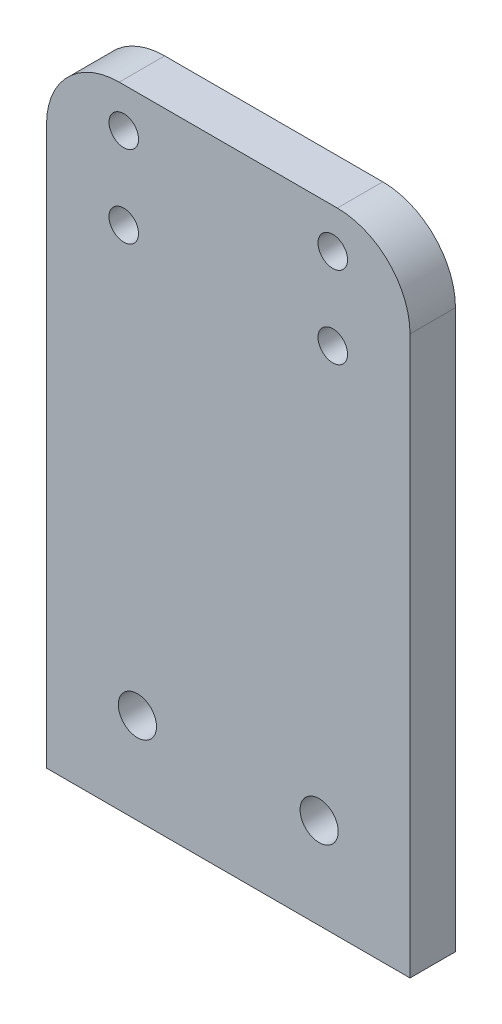
ISO-10303-21;
HEADER;
FILE_DESCRIPTION(('STEP AP214'),'2;1');
FILE_NAME('part.step','',(''),(''),'','','');
FILE_SCHEMA(('AUTOMOTIVE_DESIGN { 1 0 10303 214 1 1 1 1 }'));
ENDSEC;
DATA;
#1=APPLICATION_CONTEXT('core data for automotive mechanical design processes');
#2=APPLICATION_PROTOCOL_DEFINITION('international standard','automotive_design',2000,#1);
#3=PRODUCT_CONTEXT('',#1,'mechanical');
#4=PRODUCT('Part','Part','',(#3));
#5=PRODUCT_RELATED_PRODUCT_CATEGORY('part','',(#4));
#6=PRODUCT_DEFINITION_FORMATION('','',#4);
#7=PRODUCT_DEFINITION_CONTEXT('part definition',#1,'design');
#8=PRODUCT_DEFINITION('design','',#6,#7);
#9=PRODUCT_DEFINITION_SHAPE('','',#8);
#10=(LENGTH_UNIT() NAMED_UNIT(*) SI_UNIT(.MILLI.,.METRE.));
#11=(NAMED_UNIT(*) PLANE_ANGLE_UNIT() SI_UNIT($,.RADIAN.));
#12=(NAMED_UNIT(*) SI_UNIT($,.STERADIAN.) SOLID_ANGLE_UNIT());
#13=UNCERTAINTY_MEASURE_WITH_UNIT(LENGTH_MEASURE(1.E-05),#10,'distance_accuracy_value','');
#14=(GEOMETRIC_REPRESENTATION_CONTEXT(3) GLOBAL_UNCERTAINTY_ASSIGNED_CONTEXT((#13)) GLOBAL_UNIT_ASSIGNED_CONTEXT((#10,
#11,#12)) REPRESENTATION_CONTEXT('',''));
#15=CARTESIAN_POINT('',(0.,0.,0.));
#16=DIRECTION('',(0.,0.,1.));
#17=DIRECTION('',(1.,0.,0.));
#18=AXIS2_PLACEMENT_3D('',#15,#16,#17);
#19=CARTESIAN_POINT('',(-1740.42117355049,-1861.91940911594,10.));
#20=DIRECTION('',(-1.,0.,0.));
#21=DIRECTION('',(0.,0.,1.));
#22=AXIS2_PLACEMENT_3D('',#19,#20,#21);
#23=PLANE('',#22);
#24=DIRECTION('',(0.,1.,0.));
#25=VECTOR('',#24,1.);
#26=CARTESIAN_POINT('',(-1740.42117355049,-1861.91940911594,0.));
#27=LINE('',#26,#25);
#28=CARTESIAN_POINT('',(-1740.42117355049,-1861.91940911594,0.));
#29=VERTEX_POINT('',#28);
#30=CARTESIAN_POINT('',(-1740.42117355049,-1739.16464373715,0.));
#31=VERTEX_POINT('',#30);
#32=EDGE_CURVE('E112',#29,#31,#27,.T.);
#33=ORIENTED_EDGE('',*,*,#32,.T.);
#34=DIRECTION('',(0.,0.,-1.));
#35=VECTOR('',#34,1.);
#36=CARTESIAN_POINT('',(-1740.42117355049,-1739.16464373715,10.));
#37=LINE('',#36,#35);
#38=CARTESIAN_POINT('',(-1740.42117355049,-1739.16464373715,10.));
#39=VERTEX_POINT('',#38);
#40=EDGE_CURVE('E56',#31,#39,#37,.F.);
#41=ORIENTED_EDGE('',*,*,#40,.T.);
#42=DIRECTION('',(0.,1.,0.));
#43=VECTOR('',#42,1.);
#44=CARTESIAN_POINT('',(-1740.42117355049,-1861.91940911594,10.));
#45=LINE('',#44,#43);
#46=CARTESIAN_POINT('',(-1740.42117355049,-1861.91940911594,10.));
#47=VERTEX_POINT('',#46);
#48=EDGE_CURVE('E120',#47,#39,#45,.T.);
#49=ORIENTED_EDGE('',*,*,#48,.F.);
#50=DIRECTION('',(0.,0.,-1.));
#51=VECTOR('',#50,1.);
#52=CARTESIAN_POINT('',(-1740.42117355049,-1861.91940911594,10.));
#53=LINE('',#52,#51);
#54=EDGE_CURVE('E104',#47,#29,#53,.T.);
#55=ORIENTED_EDGE('',*,*,#54,.T.);
#56=EDGE_LOOP('',(#33,#41,#49,#55));
#57=FACE_BOUND('',#56,.T.);
#58=ADVANCED_FACE('F33',(#57),#23,.F.);
#59=CARTESIAN_POINT('',(-1820.42117355045,-1723.16464373715,10.));
#60=DIRECTION('',(0.,-1.,0.));
#61=DIRECTION('',(0.,0.,-1.));
#62=AXIS2_PLACEMENT_3D('',#59,#60,#61);
#63=PLANE('',#62);
#64=DIRECTION('',(-1.,0.,0.));
#65=VECTOR('',#64,1.);
#66=CARTESIAN_POINT('',(-1820.42117355045,-1723.16464373715,10.));
#67=LINE('',#66,#65);
#68=CARTESIAN_POINT('',(-1756.42117355049,-1723.16464373715,10.));
#69=VERTEX_POINT('',#68);
#70=CARTESIAN_POINT('',(-1804.42117355045,-1723.16464373715,10.));
#71=VERTEX_POINT('',#70);
#72=EDGE_CURVE('E94',#69,#71,#67,.T.);
#73=ORIENTED_EDGE('',*,*,#72,.F.);
#74=DIRECTION('',(0.,0.,-1.));
#75=VECTOR('',#74,1.);
#76=CARTESIAN_POINT('',(-1756.42117355049,-1723.16464373715,10.));
#77=LINE('',#76,#75);
#78=CARTESIAN_POINT('',(-1756.42117355049,-1723.16464373715,0.));
#79=VERTEX_POINT('',#78);
#80=EDGE_CURVE('E123',#69,#79,#77,.T.);
#81=ORIENTED_EDGE('',*,*,#80,.T.);
#82=DIRECTION('',(-1.,0.,0.));
#83=VECTOR('',#82,1.);
#84=CARTESIAN_POINT('',(-1820.42117355045,-1723.16464373715,0.));
#85=LINE('',#84,#83);
#86=CARTESIAN_POINT('',(-1804.42117355045,-1723.16464373715,0.));
#87=VERTEX_POINT('',#86);
#88=EDGE_CURVE('E114',#79,#87,#85,.T.);
#89=ORIENTED_EDGE('',*,*,#88,.T.);
#90=DIRECTION('',(0.,0.,-1.));
#91=VECTOR('',#90,1.);
#92=CARTESIAN_POINT('',(-1804.42117355045,-1723.16464373715,10.));
#93=LINE('',#92,#91);
#94=EDGE_CURVE('E103',#87,#71,#93,.F.);
#95=ORIENTED_EDGE('',*,*,#94,.T.);
#96=EDGE_LOOP('',(#73,#81,#89,#95));
#97=FACE_BOUND('',#96,.T.);
#98=ADVANCED_FACE('F136',(#97),#63,.F.);
#99=CARTESIAN_POINT('',(-1820.42117355045,-1861.91940911594,10.));
#100=DIRECTION('',(1.,0.,0.));
#101=DIRECTION('',(0.,0.,-1.));
#102=AXIS2_PLACEMENT_3D('',#99,#100,#101);
#103=PLANE('',#102);
#104=DIRECTION('',(0.,-1.,0.));
#105=VECTOR('',#104,1.);
#106=CARTESIAN_POINT('',(-1820.42117355045,-1861.91940911594,10.));
#107=LINE('',#106,#105);
#108=CARTESIAN_POINT('',(-1820.42117355045,-1739.16464373715,10.));
#109=VERTEX_POINT('',#108);
#110=CARTESIAN_POINT('',(-1820.42117355045,-1861.91940911594,10.));
#111=VERTEX_POINT('',#110);
#112=EDGE_CURVE('E86',#109,#111,#107,.T.);
#113=ORIENTED_EDGE('',*,*,#112,.F.);
#114=DIRECTION('',(0.,0.,-1.));
#115=VECTOR('',#114,1.);
#116=CARTESIAN_POINT('',(-1820.42117355045,-1739.16464373715,10.));
#117=LINE('',#116,#115);
#118=CARTESIAN_POINT('',(-1820.42117355045,-1739.16464373715,0.));
#119=VERTEX_POINT('',#118);
#120=EDGE_CURVE('E11',#109,#119,#117,.T.);
#121=ORIENTED_EDGE('',*,*,#120,.T.);
#122=DIRECTION('',(0.,-1.,0.));
#123=VECTOR('',#122,1.);
#124=CARTESIAN_POINT('',(-1820.42117355045,-1861.91940911594,0.));
#125=LINE('',#124,#123);
#126=CARTESIAN_POINT('',(-1820.42117355045,-1861.91940911594,0.));
#127=VERTEX_POINT('',#126);
#128=EDGE_CURVE('E100',#119,#127,#125,.T.);
#129=ORIENTED_EDGE('',*,*,#128,.T.);
#130=DIRECTION('',(0.,0.,-1.));
#131=VECTOR('',#130,1.);
#132=CARTESIAN_POINT('',(-1820.42117355045,-1861.91940911594,10.));
#133=LINE('',#132,#131);
#134=EDGE_CURVE('E97',#111,#127,#133,.T.);
#135=ORIENTED_EDGE('',*,*,#134,.F.);
#136=EDGE_LOOP('',(#113,#121,#129,#135));
#137=FACE_BOUND('',#136,.T.);
#138=ADVANCED_FACE('F98',(#137),#103,.F.);
#139=CARTESIAN_POINT('',(-1740.42117355049,-1861.91940911594,10.));
#140=DIRECTION('',(0.,1.,0.));
#141=DIRECTION('',(0.,0.,1.));
#142=AXIS2_PLACEMENT_3D('',#139,#140,#141);
#143=PLANE('',#142);
#144=DIRECTION('',(1.,0.,0.));
#145=VECTOR('',#144,1.);
#146=CARTESIAN_POINT('',(-1740.42117355049,-1861.91940911594,0.));
#147=LINE('',#146,#145);
#148=EDGE_CURVE('E119',#127,#29,#147,.T.);
#149=ORIENTED_EDGE('',*,*,#148,.T.);
#150=ORIENTED_EDGE('',*,*,#54,.F.);
#151=DIRECTION('',(1.,0.,0.));
#152=VECTOR('',#151,1.);
#153=CARTESIAN_POINT('',(-1740.42117355049,-1861.91940911594,10.));
#154=LINE('',#153,#152);
#155=EDGE_CURVE('E90',#111,#47,#154,.T.);
#156=ORIENTED_EDGE('',*,*,#155,.F.);
#157=ORIENTED_EDGE('',*,*,#134,.T.);
#158=EDGE_LOOP('',(#149,#150,#156,#157));
#159=FACE_BOUND('',#158,.T.);
#160=ADVANCED_FACE('F106',(#159),#143,.F.);
#161=CARTESIAN_POINT('',(0.,0.,10.));
#162=DIRECTION('',(0.,0.,-1.));
#163=DIRECTION('',(-1.,0.,0.));
#164=AXIS2_PLACEMENT_3D('',#161,#162,#163);
#165=PLANE('',#164);
#166=CARTESIAN_POINT('',(-1757.4211735478,-1749.91940911601,10.));
#167=DIRECTION('',(0.,0.,1.));
#168=DIRECTION('',(1.,0.,0.));
#169=AXIS2_PLACEMENT_3D('',#166,#167,#168);
#170=CIRCLE('',#169,3.24999999999997);
#171=CARTESIAN_POINT('',(-1754.1711735478,-1749.91940911601,10.));
#172=VERTEX_POINT('',#171);
#173=EDGE_CURVE('E175',#172,#172,#170,.T.);
#174=ORIENTED_EDGE('',*,*,#173,.F.);
#175=EDGE_LOOP('',(#174));
#176=FACE_BOUND('',#175,.T.);
#177=CARTESIAN_POINT('',(-1757.4211735478,-1731.91940911601,10.));
#178=DIRECTION('',(0.,0.,1.));
#179=DIRECTION('',(1.,0.,0.));
#180=AXIS2_PLACEMENT_3D('',#177,#178,#179);
#181=CIRCLE('',#180,3.24999999999997);
#182=CARTESIAN_POINT('',(-1754.1711735478,-1731.91940911601,10.));
#183=VERTEX_POINT('',#182);
#184=EDGE_CURVE('E169',#183,#183,#181,.T.);
#185=ORIENTED_EDGE('',*,*,#184,.F.);
#186=EDGE_LOOP('',(#185));
#187=FACE_BOUND('',#186,.T.);
#188=CARTESIAN_POINT('',(-1803.4211735478,-1749.91940911601,10.));
#189=DIRECTION('',(0.,0.,1.));
#190=DIRECTION('',(1.,0.,0.));
#191=AXIS2_PLACEMENT_3D('',#188,#189,#190);
#192=CIRCLE('',#191,3.25000000000018);
#193=CARTESIAN_POINT('',(-1800.1711735478,-1749.91940911601,10.));
#194=VERTEX_POINT('',#193);
#195=EDGE_CURVE('E163',#194,#194,#192,.T.);
#196=ORIENTED_EDGE('',*,*,#195,.F.);
#197=EDGE_LOOP('',(#196));
#198=FACE_BOUND('',#197,.T.);
#199=CARTESIAN_POINT('',(-1803.4211735478,-1731.91940911601,10.));
#200=DIRECTION('',(0.,0.,1.));
#201=DIRECTION('',(1.,0.,0.));
#202=AXIS2_PLACEMENT_3D('',#199,#200,#201);
#203=CIRCLE('',#202,3.24999999999997);
#204=CARTESIAN_POINT('',(-1800.1711735478,-1731.91940911601,10.));
#205=VERTEX_POINT('',#204);
#206=EDGE_CURVE('E157',#205,#205,#203,.T.);
#207=ORIENTED_EDGE('',*,*,#206,.F.);
#208=EDGE_LOOP('',(#207));
#209=FACE_BOUND('',#208,.T.);
#210=CARTESIAN_POINT('',(-1760.42117355049,-1841.91940911594,10.));
#211=DIRECTION('',(0.,0.,1.));
#212=DIRECTION('',(1.,0.,0.));
#213=AXIS2_PLACEMENT_3D('',#210,#211,#212);
#214=CIRCLE('',#213,4.19999999999998);
#215=CARTESIAN_POINT('',(-1756.22117355049,-1841.91940911594,10.));
#216=VERTEX_POINT('',#215);
#217=EDGE_CURVE('E153',#216,#216,#214,.T.);
#218=ORIENTED_EDGE('',*,*,#217,.F.);
#219=EDGE_LOOP('',(#218));
#220=FACE_BOUND('',#219,.T.);
#221=CARTESIAN_POINT('',(-1800.42117355048,-1841.91940911595,10.));
#222=DIRECTION('',(0.,0.,1.));
#223=DIRECTION('',(1.,0.,0.));
#224=AXIS2_PLACEMENT_3D('',#221,#222,#223);
#225=CIRCLE('',#224,4.19999999999998);
#226=CARTESIAN_POINT('',(-1796.22117355048,-1841.91940911595,10.));
#227=VERTEX_POINT('',#226);
#228=EDGE_CURVE('E147',#227,#227,#225,.T.);
#229=ORIENTED_EDGE('',*,*,#228,.F.);
#230=EDGE_LOOP('',(#229));
#231=FACE_BOUND('',#230,.T.);
#232=ORIENTED_EDGE('',*,*,#48,.T.);
#233=CARTESIAN_POINT('',(-1756.42117355049,-1739.16464373715,10.));
#234=DIRECTION('',(0.,0.,-1.));
#235=DIRECTION('',(-1.,0.,0.));
#236=AXIS2_PLACEMENT_3D('',#233,#234,#235);
#237=CIRCLE('',#236,16.);
#238=EDGE_CURVE('E41',#39,#69,#237,.F.);
#239=ORIENTED_EDGE('',*,*,#238,.T.);
#240=ORIENTED_EDGE('',*,*,#72,.T.);
#241=CARTESIAN_POINT('',(-1804.42117355045,-1739.16464373715,10.));
#242=DIRECTION('',(0.,0.,-1.));
#243=DIRECTION('',(-1.,0.,0.));
#244=AXIS2_PLACEMENT_3D('',#241,#242,#243);
#245=CIRCLE('',#244,16.);
#246=EDGE_CURVE('E48',#71,#109,#245,.F.);
#247=ORIENTED_EDGE('',*,*,#246,.T.);
#248=ORIENTED_EDGE('',*,*,#112,.T.);
#249=ORIENTED_EDGE('',*,*,#155,.T.);
#250=EDGE_LOOP('',(#232,#239,#240,#247,#248,#249));
#251=FACE_BOUND('',#250,.T.);
#252=ADVANCED_FACE('F88',(#176,#187,#198,#209,#220,#231,#251),#165,.F.);
#253=CARTESIAN_POINT('',(0.,0.,0.));
#254=DIRECTION('',(0.,0.,-1.));
#255=DIRECTION('',(-1.,0.,0.));
#256=AXIS2_PLACEMENT_3D('',#253,#254,#255);
#257=PLANE('',#256);
#258=CARTESIAN_POINT('',(-1757.4211735478,-1749.91940911601,0.));
#259=DIRECTION('',(0.,0.,1.));
#260=DIRECTION('',(1.,0.,0.));
#261=AXIS2_PLACEMENT_3D('',#258,#259,#260);
#262=CIRCLE('',#261,3.24999999999997);
#263=CARTESIAN_POINT('',(-1754.1711735478,-1749.91940911601,0.));
#264=VERTEX_POINT('',#263);
#265=EDGE_CURVE('E172',#264,#264,#262,.T.);
#266=ORIENTED_EDGE('',*,*,#265,.T.);
#267=EDGE_LOOP('',(#266));
#268=FACE_BOUND('',#267,.T.);
#269=CARTESIAN_POINT('',(-1757.4211735478,-1731.91940911601,0.));
#270=DIRECTION('',(0.,0.,1.));
#271=DIRECTION('',(1.,0.,0.));
#272=AXIS2_PLACEMENT_3D('',#269,#270,#271);
#273=CIRCLE('',#272,3.24999999999997);
#274=CARTESIAN_POINT('',(-1754.1711735478,-1731.91940911601,0.));
#275=VERTEX_POINT('',#274);
#276=EDGE_CURVE('E166',#275,#275,#273,.T.);
#277=ORIENTED_EDGE('',*,*,#276,.T.);
#278=EDGE_LOOP('',(#277));
#279=FACE_BOUND('',#278,.T.);
#280=CARTESIAN_POINT('',(-1803.4211735478,-1749.91940911601,0.));
#281=DIRECTION('',(0.,0.,1.));
#282=DIRECTION('',(1.,0.,0.));
#283=AXIS2_PLACEMENT_3D('',#280,#281,#282);
#284=CIRCLE('',#283,3.25000000000018);
#285=CARTESIAN_POINT('',(-1800.1711735478,-1749.91940911601,0.));
#286=VERTEX_POINT('',#285);
#287=EDGE_CURVE('E160',#286,#286,#284,.T.);
#288=ORIENTED_EDGE('',*,*,#287,.T.);
#289=EDGE_LOOP('',(#288));
#290=FACE_BOUND('',#289,.T.);
#291=CARTESIAN_POINT('',(-1803.4211735478,-1731.91940911601,0.));
#292=DIRECTION('',(0.,0.,1.));
#293=DIRECTION('',(1.,0.,0.));
#294=AXIS2_PLACEMENT_3D('',#291,#292,#293);
#295=CIRCLE('',#294,3.24999999999997);
#296=CARTESIAN_POINT('',(-1800.1711735478,-1731.91940911601,0.));
#297=VERTEX_POINT('',#296);
#298=EDGE_CURVE('E156',#297,#297,#295,.T.);
#299=ORIENTED_EDGE('',*,*,#298,.T.);
#300=EDGE_LOOP('',(#299));
#301=FACE_BOUND('',#300,.T.);
#302=CARTESIAN_POINT('',(-1760.42117355049,-1841.91940911594,0.));
#303=DIRECTION('',(0.,0.,1.));
#304=DIRECTION('',(1.,0.,0.));
#305=AXIS2_PLACEMENT_3D('',#302,#303,#304);
#306=CIRCLE('',#305,4.19999999999998);
#307=CARTESIAN_POINT('',(-1756.22117355049,-1841.91940911594,0.));
#308=VERTEX_POINT('',#307);
#309=EDGE_CURVE('E150',#308,#308,#306,.T.);
#310=ORIENTED_EDGE('',*,*,#309,.T.);
#311=EDGE_LOOP('',(#310));
#312=FACE_BOUND('',#311,.T.);
#313=CARTESIAN_POINT('',(-1800.42117355048,-1841.91940911595,0.));
#314=DIRECTION('',(0.,0.,1.));
#315=DIRECTION('',(1.,0.,0.));
#316=AXIS2_PLACEMENT_3D('',#313,#314,#315);
#317=CIRCLE('',#316,4.19999999999998);
#318=CARTESIAN_POINT('',(-1796.22117355048,-1841.91940911595,0.));
#319=VERTEX_POINT('',#318);
#320=EDGE_CURVE('E115',#319,#319,#317,.T.);
#321=ORIENTED_EDGE('',*,*,#320,.T.);
#322=EDGE_LOOP('',(#321));
#323=FACE_BOUND('',#322,.T.);
#324=ORIENTED_EDGE('',*,*,#88,.F.);
#325=CARTESIAN_POINT('',(-1756.42117355049,-1739.16464373715,0.));
#326=DIRECTION('',(0.,0.,-1.));
#327=DIRECTION('',(-1.,0.,0.));
#328=AXIS2_PLACEMENT_3D('',#325,#326,#327);
#329=CIRCLE('',#328,16.);
#330=EDGE_CURVE('E128',#79,#31,#329,.T.);
#331=ORIENTED_EDGE('',*,*,#330,.T.);
#332=ORIENTED_EDGE('',*,*,#32,.F.);
#333=ORIENTED_EDGE('',*,*,#148,.F.);
#334=ORIENTED_EDGE('',*,*,#128,.F.);
#335=CARTESIAN_POINT('',(-1804.42117355045,-1739.16464373715,0.));
#336=DIRECTION('',(0.,0.,-1.));
#337=DIRECTION('',(-1.,0.,0.));
#338=AXIS2_PLACEMENT_3D('',#335,#336,#337);
#339=CIRCLE('',#338,16.);
#340=EDGE_CURVE('E126',#119,#87,#339,.T.);
#341=ORIENTED_EDGE('',*,*,#340,.T.);
#342=EDGE_LOOP('',(#324,#331,#332,#333,#334,#341));
#343=FACE_BOUND('',#342,.T.);
#344=ADVANCED_FACE('F142',(#268,#279,#290,#301,#312,#323,#343),#257,.T.);
#345=CARTESIAN_POINT('',(-1800.42117355048,-1841.91940911595,10.));
#346=DIRECTION('',(0.,0.,1.));
#347=DIRECTION('',(1.,0.,0.));
#348=AXIS2_PLACEMENT_3D('',#345,#346,#347);
#349=CYLINDRICAL_SURFACE('',#348,4.19999999999998);
#350=ORIENTED_EDGE('',*,*,#320,.F.);
#351=EDGE_LOOP('',(#350));
#352=FACE_BOUND('',#351,.T.);
#353=ORIENTED_EDGE('',*,*,#228,.T.);
#354=EDGE_LOOP('',(#353));
#355=FACE_BOUND('',#354,.T.);
#356=ADVANCED_FACE('F203',(#352,#355),#349,.F.);
#357=CARTESIAN_POINT('',(-1760.42117355049,-1841.91940911594,10.));
#358=DIRECTION('',(0.,0.,1.));
#359=DIRECTION('',(1.,0.,0.));
#360=AXIS2_PLACEMENT_3D('',#357,#358,#359);
#361=CYLINDRICAL_SURFACE('',#360,4.19999999999998);
#362=ORIENTED_EDGE('',*,*,#309,.F.);
#363=EDGE_LOOP('',(#362));
#364=FACE_BOUND('',#363,.T.);
#365=ORIENTED_EDGE('',*,*,#217,.T.);
#366=EDGE_LOOP('',(#365));
#367=FACE_BOUND('',#366,.T.);
#368=ADVANCED_FACE('F205',(#364,#367),#361,.F.);
#369=CARTESIAN_POINT('',(-1803.4211735478,-1731.91940911601,0.));
#370=DIRECTION('',(0.,0.,1.));
#371=DIRECTION('',(1.,0.,0.));
#372=AXIS2_PLACEMENT_3D('',#369,#370,#371);
#373=CYLINDRICAL_SURFACE('',#372,3.24999999999997);
#374=ORIENTED_EDGE('',*,*,#298,.F.);
#375=EDGE_LOOP('',(#374));
#376=FACE_BOUND('',#375,.T.);
#377=ORIENTED_EDGE('',*,*,#206,.T.);
#378=EDGE_LOOP('',(#377));
#379=FACE_BOUND('',#378,.T.);
#380=ADVANCED_FACE('F212',(#376,#379),#373,.F.);
#381=CARTESIAN_POINT('',(-1803.4211735478,-1749.91940911601,0.));
#382=DIRECTION('',(0.,0.,1.));
#383=DIRECTION('',(1.,0.,0.));
#384=AXIS2_PLACEMENT_3D('',#381,#382,#383);
#385=CYLINDRICAL_SURFACE('',#384,3.25000000000018);
#386=ORIENTED_EDGE('',*,*,#287,.F.);
#387=EDGE_LOOP('',(#386));
#388=FACE_BOUND('',#387,.T.);
#389=ORIENTED_EDGE('',*,*,#195,.T.);
#390=EDGE_LOOP('',(#389));
#391=FACE_BOUND('',#390,.T.);
#392=ADVANCED_FACE('F282',(#388,#391),#385,.F.);
#393=CARTESIAN_POINT('',(-1757.4211735478,-1731.91940911601,0.));
#394=DIRECTION('',(0.,0.,1.));
#395=DIRECTION('',(1.,0.,0.));
#396=AXIS2_PLACEMENT_3D('',#393,#394,#395);
#397=CYLINDRICAL_SURFACE('',#396,3.24999999999997);
#398=ORIENTED_EDGE('',*,*,#276,.F.);
#399=EDGE_LOOP('',(#398));
#400=FACE_BOUND('',#399,.T.);
#401=ORIENTED_EDGE('',*,*,#184,.T.);
#402=EDGE_LOOP('',(#401));
#403=FACE_BOUND('',#402,.T.);
#404=ADVANCED_FACE('F186',(#400,#403),#397,.F.);
#405=CARTESIAN_POINT('',(-1757.4211735478,-1749.91940911601,0.));
#406=DIRECTION('',(0.,0.,1.));
#407=DIRECTION('',(1.,0.,0.));
#408=AXIS2_PLACEMENT_3D('',#405,#406,#407);
#409=CYLINDRICAL_SURFACE('',#408,3.24999999999997);
#410=ORIENTED_EDGE('',*,*,#265,.F.);
#411=EDGE_LOOP('',(#410));
#412=FACE_BOUND('',#411,.T.);
#413=ORIENTED_EDGE('',*,*,#173,.T.);
#414=EDGE_LOOP('',(#413));
#415=FACE_BOUND('',#414,.T.);
#416=ADVANCED_FACE('F183',(#412,#415),#409,.F.);
#417=CARTESIAN_POINT('',(-1756.42117355049,-1739.16464373715,10.));
#418=DIRECTION('',(0.,0.,-1.));
#419=DIRECTION('',(-1.,0.,0.));
#420=AXIS2_PLACEMENT_3D('',#417,#418,#419);
#421=CYLINDRICAL_SURFACE('',#420,16.);
#422=ORIENTED_EDGE('',*,*,#238,.F.);
#423=ORIENTED_EDGE('',*,*,#40,.F.);
#424=ORIENTED_EDGE('',*,*,#330,.F.);
#425=ORIENTED_EDGE('',*,*,#80,.F.);
#426=EDGE_LOOP('',(#422,#423,#424,#425));
#427=FACE_BOUND('',#426,.T.);
#428=ADVANCED_FACE('F139',(#427),#421,.T.);
#429=CARTESIAN_POINT('',(-1804.42117355045,-1739.16464373715,10.));
#430=DIRECTION('',(0.,0.,-1.));
#431=DIRECTION('',(-1.,0.,0.));
#432=AXIS2_PLACEMENT_3D('',#429,#430,#431);
#433=CYLINDRICAL_SURFACE('',#432,16.);
#434=ORIENTED_EDGE('',*,*,#246,.F.);
#435=ORIENTED_EDGE('',*,*,#94,.F.);
#436=ORIENTED_EDGE('',*,*,#340,.F.);
#437=ORIENTED_EDGE('',*,*,#120,.F.);
#438=EDGE_LOOP('',(#434,#435,#436,#437));
#439=FACE_BOUND('',#438,.T.);
#440=ADVANCED_FACE('F35',(#439),#433,.T.);
#441=CLOSED_SHELL('',(#58,#98,#138,#160,#252,#344,#356,#368,#380,#392,#404,#416,#428,#440));
#442=MANIFOLD_SOLID_BREP('B2',#441);
#443=ADVANCED_BREP_SHAPE_REPRESENTATION('',(#18,#442),#14);
#444=SHAPE_DEFINITION_REPRESENTATION(#9,#443);
ENDSEC;
END-ISO-10303-21;
